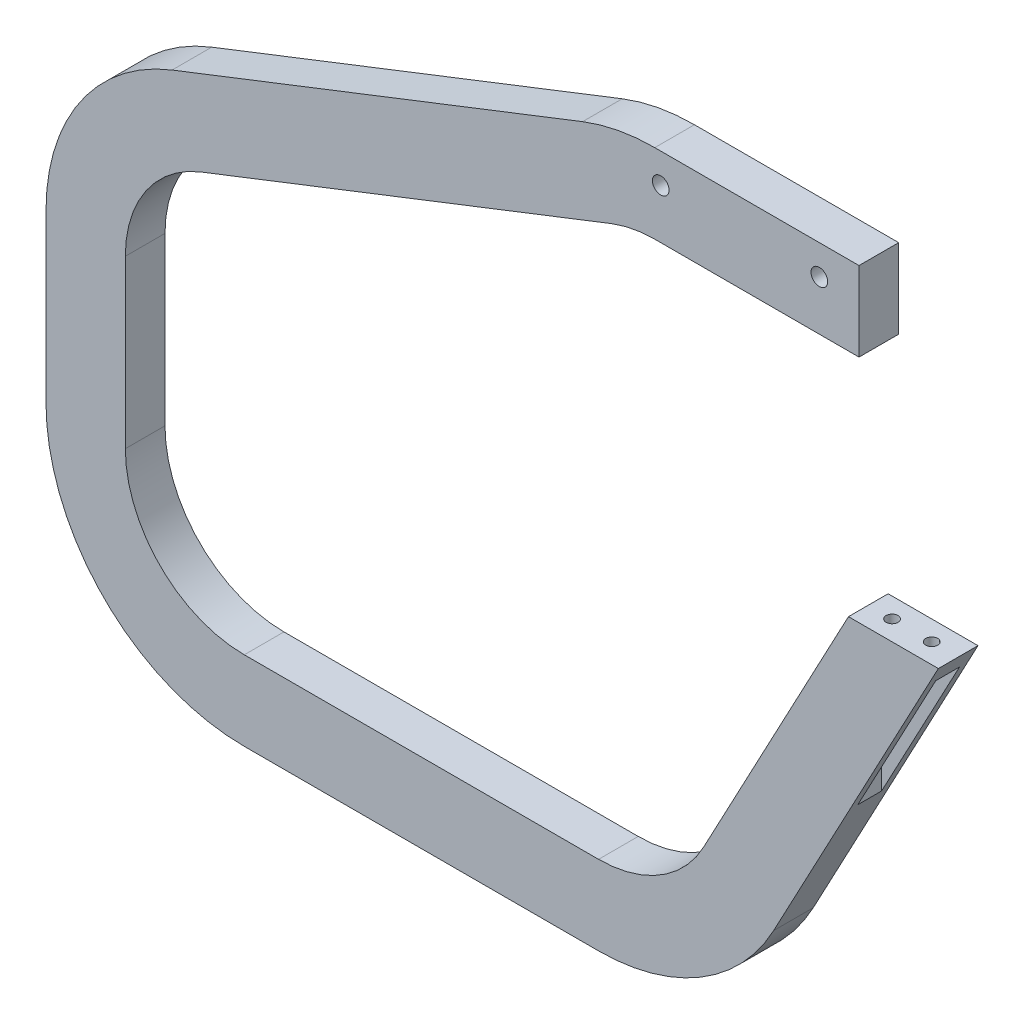
ISO-10303-21;
HEADER;
FILE_DESCRIPTION(('STEP AP214'),'2;1');
FILE_NAME('part.step','',(''),(''),'','','');
FILE_SCHEMA(('AUTOMOTIVE_DESIGN { 1 0 10303 214 1 1 1 1 }'));
ENDSEC;
DATA;
#1=APPLICATION_CONTEXT('core data for automotive mechanical design processes');
#2=APPLICATION_PROTOCOL_DEFINITION('international standard','automotive_design',2000,#1);
#3=PRODUCT_CONTEXT('',#1,'mechanical');
#4=PRODUCT('Part','Part','',(#3));
#5=PRODUCT_RELATED_PRODUCT_CATEGORY('part','',(#4));
#6=PRODUCT_DEFINITION_FORMATION('','',#4);
#7=PRODUCT_DEFINITION_CONTEXT('part definition',#1,'design');
#8=PRODUCT_DEFINITION('design','',#6,#7);
#9=PRODUCT_DEFINITION_SHAPE('','',#8);
#10=(LENGTH_UNIT() NAMED_UNIT(*) SI_UNIT(.MILLI.,.METRE.));
#11=(NAMED_UNIT(*) PLANE_ANGLE_UNIT() SI_UNIT($,.RADIAN.));
#12=(NAMED_UNIT(*) SI_UNIT($,.STERADIAN.) SOLID_ANGLE_UNIT());
#13=UNCERTAINTY_MEASURE_WITH_UNIT(LENGTH_MEASURE(1.E-05),#10,'distance_accuracy_value','');
#14=(GEOMETRIC_REPRESENTATION_CONTEXT(3) GLOBAL_UNCERTAINTY_ASSIGNED_CONTEXT((#13)) GLOBAL_UNIT_ASSIGNED_CONTEXT((#10,
#11,#12)) REPRESENTATION_CONTEXT('',''));
#15=CARTESIAN_POINT('',(0.,0.,0.));
#16=DIRECTION('',(0.,0.,1.));
#17=DIRECTION('',(1.,0.,0.));
#18=AXIS2_PLACEMENT_3D('',#15,#16,#17);
#19=CARTESIAN_POINT('',(0.,-240.,10.));
#20=DIRECTION('',(0.,1.,0.));
#21=DIRECTION('',(-1.,0.,0.));
#22=AXIS2_PLACEMENT_3D('',#19,#20,#21);
#23=PLANE('',#22);
#24=DIRECTION('',(1.,0.,0.));
#25=VECTOR('',#24,1.);
#26=CARTESIAN_POINT('',(0.,-240.,0.));
#27=LINE('',#26,#25);
#28=CARTESIAN_POINT('',(-387.930073268224,-240.,0.));
#29=VERTEX_POINT('',#28);
#30=CARTESIAN_POINT('',(-298.601858771946,-240.,0.));
#31=VERTEX_POINT('',#30);
#32=EDGE_CURVE('E227',#29,#31,#27,.T.);
#33=ORIENTED_EDGE('',*,*,#32,.T.);
#34=DIRECTION('',(0.,0.,-1.));
#35=VECTOR('',#34,1.);
#36=CARTESIAN_POINT('',(-298.601858771946,-240.,10.));
#37=LINE('',#36,#35);
#38=CARTESIAN_POINT('',(-298.601858771946,-240.,10.));
#39=VERTEX_POINT('',#38);
#40=EDGE_CURVE('E11',#39,#31,#37,.T.);
#41=ORIENTED_EDGE('',*,*,#40,.F.);
#42=DIRECTION('',(1.,0.,0.));
#43=VECTOR('',#42,1.);
#44=CARTESIAN_POINT('',(0.,-240.,10.));
#45=LINE('',#44,#43);
#46=CARTESIAN_POINT('',(-387.930073268224,-240.,10.));
#47=VERTEX_POINT('',#46);
#48=EDGE_CURVE('E562',#47,#39,#45,.T.);
#49=ORIENTED_EDGE('',*,*,#48,.F.);
#50=DIRECTION('',(0.,0.,-1.));
#51=VECTOR('',#50,1.);
#52=CARTESIAN_POINT('',(-387.930073268224,-240.,10.));
#53=LINE('',#52,#51);
#54=EDGE_CURVE('E216',#47,#29,#53,.T.);
#55=ORIENTED_EDGE('',*,*,#54,.T.);
#56=EDGE_LOOP('',(#33,#41,#49,#55));
#57=FACE_BOUND('',#56,.T.);
#58=ADVANCED_FACE('F39',(#57),#23,.F.);
#59=CARTESIAN_POINT('',(-298.601858771946,-190.,10.));
#60=DIRECTION('',(0.,0.,-1.));
#61=DIRECTION('',(-1.,0.,0.));
#62=AXIS2_PLACEMENT_3D('',#59,#60,#61);
#63=CYLINDRICAL_SURFACE('',#62,50.);
#64=CARTESIAN_POINT('',(-298.601858771946,-190.,0.));
#65=DIRECTION('',(0.,0.,1.));
#66=DIRECTION('',(1.,0.,0.));
#67=AXIS2_PLACEMENT_3D('',#64,#65,#66);
#68=CIRCLE('',#67,50.);
#69=CARTESIAN_POINT('',(-254.469753791034,-213.502283079603,0.));
#70=VERTEX_POINT('',#69);
#71=EDGE_CURVE('E230',#31,#70,#68,.T.);
#72=ORIENTED_EDGE('',*,*,#71,.T.);
#73=DIRECTION('',(0.,0.,-1.));
#74=VECTOR('',#73,1.);
#75=CARTESIAN_POINT('',(-254.469753791034,-213.502283079603,10.));
#76=LINE('',#75,#74);
#77=CARTESIAN_POINT('',(-254.469753791034,-213.502283079603,10.));
#78=VERTEX_POINT('',#77);
#79=EDGE_CURVE('E47',#78,#70,#76,.T.);
#80=ORIENTED_EDGE('',*,*,#79,.F.);
#81=CARTESIAN_POINT('',(-298.601858771946,-190.,10.));
#82=DIRECTION('',(0.,0.,1.));
#83=DIRECTION('',(1.,0.,0.));
#84=AXIS2_PLACEMENT_3D('',#81,#82,#83);
#85=CIRCLE('',#84,50.);
#86=EDGE_CURVE('E140',#39,#78,#85,.T.);
#87=ORIENTED_EDGE('',*,*,#86,.F.);
#88=ORIENTED_EDGE('',*,*,#40,.T.);
#89=EDGE_LOOP('',(#72,#80,#87,#88));
#90=FACE_BOUND('',#89,.T.);
#91=ADVANCED_FACE('F390',(#90),#63,.T.);
#92=CARTESIAN_POINT('',(-109.668188971471,58.403124508785,10.));
#93=DIRECTION('',(-0.882642099618229,0.470045661592068,0.));
#94=DIRECTION('',(-0.470045661592067,-0.882642099618229,0.));
#95=AXIS2_PLACEMENT_3D('',#92,#93,#94);
#96=PLANE('',#95);
#97=DIRECTION('',(0.,0.,-1.));
#98=VECTOR('',#97,1.);
#99=CARTESIAN_POINT('',(-235.239731932691,-177.392542567877,8.));
#100=LINE('',#99,#98);
#101=CARTESIAN_POINT('',(-235.239731932691,-177.392542567877,8.));
#102=VERTEX_POINT('',#101);
#103=CARTESIAN_POINT('',(-235.239731932691,-177.392542567876,2.));
#104=VERTEX_POINT('',#103);
#105=EDGE_CURVE('E555',#102,#104,#100,.T.);
#106=ORIENTED_EDGE('',*,*,#105,.F.);
#107=DIRECTION('',(-0.470045661592067,-0.882642099618229,0.));
#108=VECTOR('',#107,1.);
#109=CARTESIAN_POINT('',(-215.592792743044,-140.499923245137,8.));
#110=LINE('',#109,#108);
#111=CARTESIAN_POINT('',(-215.592792743044,-140.499923245137,8.));
#112=VERTEX_POINT('',#111);
#113=EDGE_CURVE('E549',#112,#102,#110,.T.);
#114=ORIENTED_EDGE('',*,*,#113,.F.);
#115=DIRECTION('',(0.,0.,-1.));
#116=VECTOR('',#115,1.);
#117=CARTESIAN_POINT('',(-215.592792743044,-140.499923245137,8.));
#118=LINE('',#117,#116);
#119=CARTESIAN_POINT('',(-215.592792743044,-140.499923245137,2.));
#120=VERTEX_POINT('',#119);
#121=EDGE_CURVE('E552',#112,#120,#118,.T.);
#122=ORIENTED_EDGE('',*,*,#121,.T.);
#123=DIRECTION('',(-0.470045661592067,-0.882642099618229,0.));
#124=VECTOR('',#123,1.);
#125=CARTESIAN_POINT('',(-215.592792743044,-140.499923245137,2.));
#126=LINE('',#125,#124);
#127=EDGE_CURVE('E540',#120,#104,#126,.T.);
#128=ORIENTED_EDGE('',*,*,#127,.T.);
#129=EDGE_LOOP('',(#106,#114,#122,#128));
#130=FACE_BOUND('',#129,.T.);
#131=DIRECTION('',(0.470045661592068,0.882642099618229,0.));
#132=VECTOR('',#131,1.);
#133=CARTESIAN_POINT('',(-109.668188971471,58.403124508785,0.));
#134=LINE('',#133,#132);
#135=CARTESIAN_POINT('',(-212.930073268212,-135.499923245137,0.));
#136=VERTEX_POINT('',#135);
#137=EDGE_CURVE('E232',#70,#136,#134,.T.);
#138=ORIENTED_EDGE('',*,*,#137,.T.);
#139=DIRECTION('',(0.,0.,-1.));
#140=VECTOR('',#139,1.);
#141=CARTESIAN_POINT('',(-212.930073268212,-135.499923245137,10.));
#142=LINE('',#141,#140);
#143=CARTESIAN_POINT('',(-212.930073268212,-135.499923245137,10.));
#144=VERTEX_POINT('',#143);
#145=EDGE_CURVE('E309',#144,#136,#142,.T.);
#146=ORIENTED_EDGE('',*,*,#145,.F.);
#147=DIRECTION('',(0.470045661592068,0.882642099618229,0.));
#148=VECTOR('',#147,1.);
#149=CARTESIAN_POINT('',(-109.668188971471,58.403124508785,10.));
#150=LINE('',#149,#148);
#151=EDGE_CURVE('E317',#78,#144,#150,.T.);
#152=ORIENTED_EDGE('',*,*,#151,.F.);
#153=ORIENTED_EDGE('',*,*,#79,.T.);
#154=EDGE_LOOP('',(#138,#146,#152,#153));
#155=FACE_BOUND('',#154,.T.);
#156=ADVANCED_FACE('F315',(#130,#155),#96,.F.);
#157=CARTESIAN_POINT('',(0.,-135.499923245137,10.));
#158=DIRECTION('',(0.,-1.,0.));
#159=DIRECTION('',(0.,0.,-1.));
#160=AXIS2_PLACEMENT_3D('',#157,#158,#159);
#161=PLANE('',#160);
#162=CARTESIAN_POINT('',(-229.592792743044,-135.499923245137,5.));
#163=DIRECTION('',(0.,-1.,0.));
#164=DIRECTION('',(1.,0.,0.));
#165=AXIS2_PLACEMENT_3D('',#162,#163,#164);
#166=CIRCLE('',#165,1.5);
#167=CARTESIAN_POINT('',(-228.092792743044,-135.499923245137,5.));
#168=VERTEX_POINT('',#167);
#169=EDGE_CURVE('E524',#168,#168,#166,.T.);
#170=ORIENTED_EDGE('',*,*,#169,.T.);
#171=EDGE_LOOP('',(#170));
#172=FACE_BOUND('',#171,.T.);
#173=CARTESIAN_POINT('',(-219.592792743044,-135.499923245137,5.));
#174=DIRECTION('',(0.,-1.,0.));
#175=DIRECTION('',(1.,0.,0.));
#176=AXIS2_PLACEMENT_3D('',#173,#174,#175);
#177=CIRCLE('',#176,1.5);
#178=CARTESIAN_POINT('',(-218.092792743044,-135.499923245137,5.));
#179=VERTEX_POINT('',#178);
#180=EDGE_CURVE('E528',#179,#179,#177,.T.);
#181=ORIENTED_EDGE('',*,*,#180,.T.);
#182=EDGE_LOOP('',(#181));
#183=FACE_BOUND('',#182,.T.);
#184=DIRECTION('',(-1.,0.,0.));
#185=VECTOR('',#184,1.);
#186=CARTESIAN_POINT('',(0.,-135.499923245137,0.));
#187=LINE('',#186,#185);
#188=CARTESIAN_POINT('',(-235.589314209303,-135.499923245137,0.));
#189=VERTEX_POINT('',#188);
#190=EDGE_CURVE('E234',#136,#189,#187,.T.);
#191=ORIENTED_EDGE('',*,*,#190,.T.);
#192=DIRECTION('',(0.,0.,-1.));
#193=VECTOR('',#192,1.);
#194=CARTESIAN_POINT('',(-235.589314209303,-135.499923245137,10.));
#195=LINE('',#194,#193);
#196=CARTESIAN_POINT('',(-235.589314209303,-135.499923245137,10.));
#197=VERTEX_POINT('',#196);
#198=EDGE_CURVE('E306',#197,#189,#195,.T.);
#199=ORIENTED_EDGE('',*,*,#198,.F.);
#200=DIRECTION('',(-1.,0.,0.));
#201=VECTOR('',#200,1.);
#202=CARTESIAN_POINT('',(0.,-135.499923245137,10.));
#203=LINE('',#202,#201);
#204=EDGE_CURVE('E335',#144,#197,#203,.T.);
#205=ORIENTED_EDGE('',*,*,#204,.F.);
#206=ORIENTED_EDGE('',*,*,#145,.T.);
#207=EDGE_LOOP('',(#191,#199,#205,#206));
#208=FACE_BOUND('',#207,.T.);
#209=ADVANCED_FACE('F325',(#172,#183,#208),#161,.F.);
#210=CARTESIAN_POINT('',(-127.321030963835,67.8040377406263,10.));
#211=DIRECTION('',(0.882642099618229,-0.470045661592068,0.));
#212=DIRECTION('',(0.470045661592068,0.882642099618229,0.));
#213=AXIS2_PLACEMENT_3D('',#210,#211,#212);
#214=PLANE('',#213);
#215=DIRECTION('',(-0.470045661592068,-0.882642099618229,0.));
#216=VECTOR('',#215,1.);
#217=CARTESIAN_POINT('',(-127.321030963835,67.8040377406263,0.));
#218=LINE('',#217,#216);
#219=CARTESIAN_POINT('',(-272.122595783399,-204.101369847762,0.));
#220=VERTEX_POINT('',#219);
#221=EDGE_CURVE('E236',#189,#220,#218,.T.);
#222=ORIENTED_EDGE('',*,*,#221,.T.);
#223=DIRECTION('',(0.,0.,-1.));
#224=VECTOR('',#223,1.);
#225=CARTESIAN_POINT('',(-272.122595783399,-204.101369847762,10.));
#226=LINE('',#225,#224);
#227=CARTESIAN_POINT('',(-272.122595783399,-204.101369847762,10.));
#228=VERTEX_POINT('',#227);
#229=EDGE_CURVE('E304',#228,#220,#226,.T.);
#230=ORIENTED_EDGE('',*,*,#229,.F.);
#231=DIRECTION('',(-0.470045661592068,-0.882642099618229,0.));
#232=VECTOR('',#231,1.);
#233=CARTESIAN_POINT('',(-127.321030963835,67.8040377406263,10.));
#234=LINE('',#233,#232);
#235=EDGE_CURVE('E331',#197,#228,#234,.T.);
#236=ORIENTED_EDGE('',*,*,#235,.F.);
#237=ORIENTED_EDGE('',*,*,#198,.T.);
#238=EDGE_LOOP('',(#222,#230,#236,#237));
#239=FACE_BOUND('',#238,.T.);
#240=ADVANCED_FACE('F329',(#239),#214,.F.);
#241=CARTESIAN_POINT('',(-298.601858771946,-190.,10.));
#242=DIRECTION('',(0.,0.,-1.));
#243=DIRECTION('',(-1.,0.,0.));
#244=AXIS2_PLACEMENT_3D('',#241,#242,#243);
#245=CYLINDRICAL_SURFACE('',#244,30.);
#246=CARTESIAN_POINT('',(-298.601858771946,-190.,0.));
#247=DIRECTION('',(0.,0.,1.));
#248=DIRECTION('',(1.,0.,0.));
#249=AXIS2_PLACEMENT_3D('',#246,#247,#248);
#250=CIRCLE('',#249,30.);
#251=CARTESIAN_POINT('',(-298.601858771946,-220.,0.));
#252=VERTEX_POINT('',#251);
#253=EDGE_CURVE('E239',#252,#220,#250,.T.);
#254=ORIENTED_EDGE('',*,*,#253,.F.);
#255=DIRECTION('',(0.,0.,-1.));
#256=VECTOR('',#255,1.);
#257=CARTESIAN_POINT('',(-298.601858771946,-220.,10.));
#258=LINE('',#257,#256);
#259=CARTESIAN_POINT('',(-298.601858771946,-220.,10.));
#260=VERTEX_POINT('',#259);
#261=EDGE_CURVE('E302',#260,#252,#258,.T.);
#262=ORIENTED_EDGE('',*,*,#261,.F.);
#263=CARTESIAN_POINT('',(-298.601858771946,-190.,10.));
#264=DIRECTION('',(0.,0.,1.));
#265=DIRECTION('',(1.,0.,0.));
#266=AXIS2_PLACEMENT_3D('',#263,#264,#265);
#267=CIRCLE('',#266,30.);
#268=EDGE_CURVE('E334',#260,#228,#267,.T.);
#269=ORIENTED_EDGE('',*,*,#268,.T.);
#270=ORIENTED_EDGE('',*,*,#229,.T.);
#271=EDGE_LOOP('',(#254,#262,#269,#270));
#272=FACE_BOUND('',#271,.T.);
#273=ADVANCED_FACE('F595',(#272),#245,.F.);
#274=CARTESIAN_POINT('',(0.,-220.,10.));
#275=DIRECTION('',(0.,1.,0.));
#276=DIRECTION('',(-1.,0.,0.));
#277=AXIS2_PLACEMENT_3D('',#274,#275,#276);
#278=PLANE('',#277);
#279=DIRECTION('',(1.,0.,0.));
#280=VECTOR('',#279,1.);
#281=CARTESIAN_POINT('',(0.,-220.,0.));
#282=LINE('',#281,#280);
#283=CARTESIAN_POINT('',(-387.930073268224,-220.,0.));
#284=VERTEX_POINT('',#283);
#285=EDGE_CURVE('E242',#284,#252,#282,.T.);
#286=ORIENTED_EDGE('',*,*,#285,.F.);
#287=DIRECTION('',(0.,0.,-1.));
#288=VECTOR('',#287,1.);
#289=CARTESIAN_POINT('',(-387.930073268224,-220.,10.));
#290=LINE('',#289,#288);
#291=CARTESIAN_POINT('',(-387.930073268224,-220.,10.));
#292=VERTEX_POINT('',#291);
#293=EDGE_CURVE('E300',#292,#284,#290,.T.);
#294=ORIENTED_EDGE('',*,*,#293,.F.);
#295=DIRECTION('',(1.,0.,0.));
#296=VECTOR('',#295,1.);
#297=CARTESIAN_POINT('',(0.,-220.,10.));
#298=LINE('',#297,#296);
#299=EDGE_CURVE('E337',#292,#260,#298,.T.);
#300=ORIENTED_EDGE('',*,*,#299,.T.);
#301=ORIENTED_EDGE('',*,*,#261,.T.);
#302=EDGE_LOOP('',(#286,#294,#300,#301));
#303=FACE_BOUND('',#302,.T.);
#304=ADVANCED_FACE('F602',(#303),#278,.T.);
#305=CARTESIAN_POINT('',(-387.930073268224,-190.,10.));
#306=DIRECTION('',(0.,0.,-1.));
#307=DIRECTION('',(-1.,0.,0.));
#308=AXIS2_PLACEMENT_3D('',#305,#306,#307);
#309=CYLINDRICAL_SURFACE('',#308,30.);
#310=CARTESIAN_POINT('',(-387.930073268224,-190.,0.));
#311=DIRECTION('',(0.,0.,1.));
#312=DIRECTION('',(1.,0.,0.));
#313=AXIS2_PLACEMENT_3D('',#310,#311,#312);
#314=CIRCLE('',#313,30.);
#315=CARTESIAN_POINT('',(-417.930073268224,-190.,0.));
#316=VERTEX_POINT('',#315);
#317=EDGE_CURVE('E245',#284,#316,#314,.F.);
#318=ORIENTED_EDGE('',*,*,#317,.T.);
#319=DIRECTION('',(0.,0.,-1.));
#320=VECTOR('',#319,1.);
#321=CARTESIAN_POINT('',(-417.930073268224,-190.,10.));
#322=LINE('',#321,#320);
#323=CARTESIAN_POINT('',(-417.930073268224,-190.,10.));
#324=VERTEX_POINT('',#323);
#325=EDGE_CURVE('E298',#324,#316,#322,.T.);
#326=ORIENTED_EDGE('',*,*,#325,.F.);
#327=CARTESIAN_POINT('',(-387.930073268224,-190.,10.));
#328=DIRECTION('',(0.,0.,1.));
#329=DIRECTION('',(1.,0.,0.));
#330=AXIS2_PLACEMENT_3D('',#327,#328,#329);
#331=CIRCLE('',#330,30.);
#332=EDGE_CURVE('E344',#292,#324,#331,.F.);
#333=ORIENTED_EDGE('',*,*,#332,.F.);
#334=ORIENTED_EDGE('',*,*,#293,.T.);
#335=EDGE_LOOP('',(#318,#326,#333,#334));
#336=FACE_BOUND('',#335,.T.);
#337=ADVANCED_FACE('F610',(#336),#309,.F.);
#338=CARTESIAN_POINT('',(-417.930073268224,0.,10.));
#339=DIRECTION('',(1.,0.,0.));
#340=DIRECTION('',(0.,0.,-1.));
#341=AXIS2_PLACEMENT_3D('',#338,#339,#340);
#342=PLANE('',#341);
#343=DIRECTION('',(0.,-1.,0.));
#344=VECTOR('',#343,1.);
#345=CARTESIAN_POINT('',(-417.930073268224,0.,0.));
#346=LINE('',#345,#344);
#347=CARTESIAN_POINT('',(-417.930073268224,-147.979949055056,0.));
#348=VERTEX_POINT('',#347);
#349=EDGE_CURVE('E248',#348,#316,#346,.T.);
#350=ORIENTED_EDGE('',*,*,#349,.F.);
#351=DIRECTION('',(0.,0.,-1.));
#352=VECTOR('',#351,1.);
#353=CARTESIAN_POINT('',(-417.930073268224,-147.979949055056,10.));
#354=LINE('',#353,#352);
#355=CARTESIAN_POINT('',(-417.930073268224,-147.979949055056,10.));
#356=VERTEX_POINT('',#355);
#357=EDGE_CURVE('E296',#356,#348,#354,.T.);
#358=ORIENTED_EDGE('',*,*,#357,.F.);
#359=DIRECTION('',(0.,-1.,0.));
#360=VECTOR('',#359,1.);
#361=CARTESIAN_POINT('',(-417.930073268224,0.,10.));
#362=LINE('',#361,#360);
#363=EDGE_CURVE('E346',#356,#324,#362,.T.);
#364=ORIENTED_EDGE('',*,*,#363,.T.);
#365=ORIENTED_EDGE('',*,*,#325,.T.);
#366=EDGE_LOOP('',(#350,#358,#364,#365));
#367=FACE_BOUND('',#366,.T.);
#368=ADVANCED_FACE('F618',(#367),#342,.T.);
#369=CARTESIAN_POINT('',(-387.930073268224,-147.979949055056,10.));
#370=DIRECTION('',(0.,0.,-1.));
#371=DIRECTION('',(-1.,0.,0.));
#372=AXIS2_PLACEMENT_3D('',#369,#370,#371);
#373=CYLINDRICAL_SURFACE('',#372,30.);
#374=CARTESIAN_POINT('',(-387.930073268224,-147.979949055056,0.));
#375=DIRECTION('',(0.,0.,1.));
#376=DIRECTION('',(1.,0.,0.));
#377=AXIS2_PLACEMENT_3D('',#374,#375,#376);
#378=CIRCLE('',#377,30.);
#379=CARTESIAN_POINT('',(-398.856791898701,-120.040607259473,0.));
#380=VERTEX_POINT('',#379);
#381=EDGE_CURVE('E251',#348,#380,#378,.F.);
#382=ORIENTED_EDGE('',*,*,#381,.T.);
#383=DIRECTION('',(0.,0.,-1.));
#384=VECTOR('',#383,1.);
#385=CARTESIAN_POINT('',(-398.856791898701,-120.040607259473,10.));
#386=LINE('',#385,#384);
#387=CARTESIAN_POINT('',(-398.856791898701,-120.040607259473,10.));
#388=VERTEX_POINT('',#387);
#389=EDGE_CURVE('E294',#388,#380,#386,.T.);
#390=ORIENTED_EDGE('',*,*,#389,.F.);
#391=CARTESIAN_POINT('',(-387.930073268224,-147.979949055056,10.));
#392=DIRECTION('',(0.,0.,1.));
#393=DIRECTION('',(1.,0.,0.));
#394=AXIS2_PLACEMENT_3D('',#391,#392,#393);
#395=CIRCLE('',#394,30.);
#396=EDGE_CURVE('E349',#356,#388,#395,.F.);
#397=ORIENTED_EDGE('',*,*,#396,.F.);
#398=ORIENTED_EDGE('',*,*,#357,.T.);
#399=EDGE_LOOP('',(#382,#390,#397,#398));
#400=FACE_BOUND('',#399,.T.);
#401=ADVANCED_FACE('F626',(#400),#373,.F.);
#402=CARTESIAN_POINT('',(-12.1934941980004,31.1784547220029,10.));
#403=DIRECTION('',(0.364223954349227,-0.931311393186088,0.));
#404=DIRECTION('',(0.931311393186088,0.364223954349227,0.));
#405=AXIS2_PLACEMENT_3D('',#402,#403,#404);
#406=PLANE('',#405);
#407=DIRECTION('',(-0.931311393186088,-0.364223954349227,0.));
#408=VECTOR('',#407,1.);
#409=CARTESIAN_POINT('',(-12.1934941980004,31.1784547220029,0.));
#410=LINE('',#409,#408);
#411=CARTESIAN_POINT('',(-295.350394850752,-79.5605814495533,0.));
#412=VERTEX_POINT('',#411);
#413=EDGE_CURVE('E254',#412,#380,#410,.T.);
#414=ORIENTED_EDGE('',*,*,#413,.F.);
#415=DIRECTION('',(0.,0.,-1.));
#416=VECTOR('',#415,1.);
#417=CARTESIAN_POINT('',(-295.350394850752,-79.5605814495533,10.));
#418=LINE('',#417,#416);
#419=CARTESIAN_POINT('',(-295.350394850752,-79.5605814495533,10.));
#420=VERTEX_POINT('',#419);
#421=EDGE_CURVE('E292',#420,#412,#418,.T.);
#422=ORIENTED_EDGE('',*,*,#421,.F.);
#423=DIRECTION('',(-0.931311393186088,-0.364223954349227,0.));
#424=VECTOR('',#423,1.);
#425=CARTESIAN_POINT('',(-12.1934941980004,31.1784547220029,10.));
#426=LINE('',#425,#424);
#427=EDGE_CURVE('E351',#420,#388,#426,.T.);
#428=ORIENTED_EDGE('',*,*,#427,.T.);
#429=ORIENTED_EDGE('',*,*,#389,.T.);
#430=EDGE_LOOP('',(#414,#422,#428,#429));
#431=FACE_BOUND('',#430,.T.);
#432=ADVANCED_FACE('F634',(#431),#406,.T.);
#433=CARTESIAN_POINT('',(-284.423676220276,-107.499923245136,10.));
#434=DIRECTION('',(0.,0.,-1.));
#435=DIRECTION('',(-1.,0.,0.));
#436=AXIS2_PLACEMENT_3D('',#433,#434,#435);
#437=CYLINDRICAL_SURFACE('',#436,30.);
#438=CARTESIAN_POINT('',(-284.423676220276,-107.499923245136,0.));
#439=DIRECTION('',(0.,0.,1.));
#440=DIRECTION('',(1.,0.,0.));
#441=AXIS2_PLACEMENT_3D('',#438,#439,#440);
#442=CIRCLE('',#441,30.);
#443=CARTESIAN_POINT('',(-284.423676220276,-77.4999232451359,0.));
#444=VERTEX_POINT('',#443);
#445=EDGE_CURVE('E257',#444,#412,#442,.T.);
#446=ORIENTED_EDGE('',*,*,#445,.F.);
#447=DIRECTION('',(0.,0.,-1.));
#448=VECTOR('',#447,1.);
#449=CARTESIAN_POINT('',(-284.423676220276,-77.4999232451359,10.));
#450=LINE('',#449,#448);
#451=CARTESIAN_POINT('',(-284.423676220276,-77.4999232451359,10.));
#452=VERTEX_POINT('',#451);
#453=EDGE_CURVE('E290',#452,#444,#450,.T.);
#454=ORIENTED_EDGE('',*,*,#453,.F.);
#455=CARTESIAN_POINT('',(-284.423676220276,-107.499923245136,10.));
#456=DIRECTION('',(0.,0.,1.));
#457=DIRECTION('',(1.,0.,0.));
#458=AXIS2_PLACEMENT_3D('',#455,#456,#457);
#459=CIRCLE('',#458,30.);
#460=EDGE_CURVE('E354',#452,#420,#459,.T.);
#461=ORIENTED_EDGE('',*,*,#460,.T.);
#462=ORIENTED_EDGE('',*,*,#421,.T.);
#463=EDGE_LOOP('',(#446,#454,#461,#462));
#464=FACE_BOUND('',#463,.T.);
#465=ADVANCED_FACE('F642',(#464),#437,.F.);
#466=CARTESIAN_POINT('',(0.,-77.4999232451359,10.));
#467=DIRECTION('',(0.,-1.,0.));
#468=DIRECTION('',(1.,0.,0.));
#469=AXIS2_PLACEMENT_3D('',#466,#467,#468);
#470=PLANE('',#469);
#471=DIRECTION('',(-1.,0.,0.));
#472=VECTOR('',#471,1.);
#473=CARTESIAN_POINT('',(0.,-77.4999232451359,0.));
#474=LINE('',#473,#472);
#475=CARTESIAN_POINT('',(-232.930073268212,-77.4999232451359,0.));
#476=VERTEX_POINT('',#475);
#477=EDGE_CURVE('E260',#476,#444,#474,.T.);
#478=ORIENTED_EDGE('',*,*,#477,.F.);
#479=DIRECTION('',(0.,0.,-1.));
#480=VECTOR('',#479,1.);
#481=CARTESIAN_POINT('',(-232.930073268212,-77.4999232451359,10.));
#482=LINE('',#481,#480);
#483=CARTESIAN_POINT('',(-232.930073268212,-77.4999232451359,10.));
#484=VERTEX_POINT('',#483);
#485=EDGE_CURVE('E288',#484,#476,#482,.T.);
#486=ORIENTED_EDGE('',*,*,#485,.F.);
#487=DIRECTION('',(-1.,0.,0.));
#488=VECTOR('',#487,1.);
#489=CARTESIAN_POINT('',(0.,-77.4999232451359,10.));
#490=LINE('',#489,#488);
#491=EDGE_CURVE('E357',#484,#452,#490,.T.);
#492=ORIENTED_EDGE('',*,*,#491,.T.);
#493=ORIENTED_EDGE('',*,*,#453,.T.);
#494=EDGE_LOOP('',(#478,#486,#492,#493));
#495=FACE_BOUND('',#494,.T.);
#496=ADVANCED_FACE('F650',(#495),#470,.T.);
#497=CARTESIAN_POINT('',(-232.930073268212,0.,10.));
#498=DIRECTION('',(-1.,0.,0.));
#499=DIRECTION('',(0.,0.,1.));
#500=AXIS2_PLACEMENT_3D('',#497,#498,#499);
#501=PLANE('',#500);
#502=DIRECTION('',(0.,1.,0.));
#503=VECTOR('',#502,1.);
#504=CARTESIAN_POINT('',(-232.930073268212,0.,0.));
#505=LINE('',#504,#503);
#506=CARTESIAN_POINT('',(-232.930073268212,-57.5,0.));
#507=VERTEX_POINT('',#506);
#508=EDGE_CURVE('E263',#476,#507,#505,.T.);
#509=ORIENTED_EDGE('',*,*,#508,.T.);
#510=DIRECTION('',(0.,0.,-1.));
#511=VECTOR('',#510,1.);
#512=CARTESIAN_POINT('',(-232.930073268212,-57.5,10.));
#513=LINE('',#512,#511);
#514=CARTESIAN_POINT('',(-232.930073268212,-57.5,10.));
#515=VERTEX_POINT('',#514);
#516=EDGE_CURVE('E285',#515,#507,#513,.T.);
#517=ORIENTED_EDGE('',*,*,#516,.F.);
#518=DIRECTION('',(0.,1.,0.));
#519=VECTOR('',#518,1.);
#520=CARTESIAN_POINT('',(-232.930073268212,0.,10.));
#521=LINE('',#520,#519);
#522=EDGE_CURVE('E360',#484,#515,#521,.T.);
#523=ORIENTED_EDGE('',*,*,#522,.F.);
#524=ORIENTED_EDGE('',*,*,#485,.T.);
#525=EDGE_LOOP('',(#509,#517,#523,#524));
#526=FACE_BOUND('',#525,.T.);
#527=ADVANCED_FACE('F658',(#526),#501,.F.);
#528=CARTESIAN_POINT('',(0.,-57.5,10.));
#529=DIRECTION('',(0.,-1.,0.));
#530=DIRECTION('',(1.,0.,0.));
#531=AXIS2_PLACEMENT_3D('',#528,#529,#530);
#532=PLANE('',#531);
#533=DIRECTION('',(-1.,0.,0.));
#534=VECTOR('',#533,1.);
#535=CARTESIAN_POINT('',(0.,-57.5,0.));
#536=LINE('',#535,#534);
#537=CARTESIAN_POINT('',(-284.423872480512,-57.5,0.));
#538=VERTEX_POINT('',#537);
#539=EDGE_CURVE('E265',#507,#538,#536,.T.);
#540=ORIENTED_EDGE('',*,*,#539,.T.);
#541=DIRECTION('',(0.,0.,-1.));
#542=VECTOR('',#541,1.);
#543=CARTESIAN_POINT('',(-284.423872480512,-57.5,10.));
#544=LINE('',#543,#542);
#545=CARTESIAN_POINT('',(-284.423872480512,-57.5,10.));
#546=VERTEX_POINT('',#545);
#547=EDGE_CURVE('E283',#546,#538,#544,.T.);
#548=ORIENTED_EDGE('',*,*,#547,.F.);
#549=DIRECTION('',(-1.,0.,0.));
#550=VECTOR('',#549,1.);
#551=CARTESIAN_POINT('',(0.,-57.5,10.));
#552=LINE('',#551,#550);
#553=EDGE_CURVE('E362',#515,#546,#552,.T.);
#554=ORIENTED_EDGE('',*,*,#553,.F.);
#555=ORIENTED_EDGE('',*,*,#516,.T.);
#556=EDGE_LOOP('',(#540,#548,#554,#555));
#557=FACE_BOUND('',#556,.T.);
#558=ADVANCED_FACE('F375',(#557),#532,.F.);
#559=CARTESIAN_POINT('',(-284.423872480512,-107.5,10.));
#560=DIRECTION('',(0.,0.,-1.));
#561=DIRECTION('',(-1.,0.,0.));
#562=AXIS2_PLACEMENT_3D('',#559,#560,#561);
#563=CYLINDRICAL_SURFACE('',#562,50.);
#564=CARTESIAN_POINT('',(-284.423872480512,-107.5,0.));
#565=DIRECTION('',(0.,0.,1.));
#566=DIRECTION('',(1.,0.,0.));
#567=AXIS2_PLACEMENT_3D('',#564,#565,#566);
#568=CIRCLE('',#567,50.);
#569=CARTESIAN_POINT('',(-302.635070197974,-60.9344303406957,0.));
#570=VERTEX_POINT('',#569);
#571=EDGE_CURVE('E268',#570,#538,#568,.F.);
#572=ORIENTED_EDGE('',*,*,#571,.F.);
#573=DIRECTION('',(0.,0.,-1.));
#574=VECTOR('',#573,1.);
#575=CARTESIAN_POINT('',(-302.635070197974,-60.9344303406957,10.));
#576=LINE('',#575,#574);
#577=CARTESIAN_POINT('',(-302.635070197974,-60.9344303406957,10.));
#578=VERTEX_POINT('',#577);
#579=EDGE_CURVE('E281',#578,#570,#576,.T.);
#580=ORIENTED_EDGE('',*,*,#579,.F.);
#581=CARTESIAN_POINT('',(-284.423872480512,-107.5,10.));
#582=DIRECTION('',(0.,0.,1.));
#583=DIRECTION('',(1.,0.,0.));
#584=AXIS2_PLACEMENT_3D('',#581,#582,#583);
#585=CIRCLE('',#584,50.);
#586=EDGE_CURVE('E364',#578,#546,#585,.F.);
#587=ORIENTED_EDGE('',*,*,#586,.T.);
#588=ORIENTED_EDGE('',*,*,#547,.T.);
#589=EDGE_LOOP('',(#572,#580,#587,#588));
#590=FACE_BOUND('',#589,.T.);
#591=ADVANCED_FACE('F368',(#590),#563,.T.);
#592=CARTESIAN_POINT('',(-19.4779732849848,49.8046825857245,10.));
#593=DIRECTION('',(0.364223954349226,-0.931311393186088,0.));
#594=DIRECTION('',(0.931311393186088,0.364223954349227,0.));
#595=AXIS2_PLACEMENT_3D('',#592,#593,#594);
#596=PLANE('',#595);
#597=DIRECTION('',(-0.931311393186088,-0.364223954349227,0.));
#598=VECTOR('',#597,1.);
#599=CARTESIAN_POINT('',(-19.4779732849848,49.8046825857245,0.));
#600=LINE('',#599,#598);
#601=CARTESIAN_POINT('',(-406.141270985686,-101.414379395751,0.));
#602=VERTEX_POINT('',#601);
#603=EDGE_CURVE('E271',#570,#602,#600,.T.);
#604=ORIENTED_EDGE('',*,*,#603,.T.);
#605=DIRECTION('',(0.,0.,-1.));
#606=VECTOR('',#605,1.);
#607=CARTESIAN_POINT('',(-406.141270985686,-101.414379395751,10.));
#608=LINE('',#607,#606);
#609=CARTESIAN_POINT('',(-406.141270985686,-101.414379395751,10.));
#610=VERTEX_POINT('',#609);
#611=EDGE_CURVE('E211',#610,#602,#608,.T.);
#612=ORIENTED_EDGE('',*,*,#611,.F.);
#613=DIRECTION('',(-0.931311393186088,-0.364223954349227,0.));
#614=VECTOR('',#613,1.);
#615=CARTESIAN_POINT('',(-19.4779732849848,49.8046825857245,10.));
#616=LINE('',#615,#614);
#617=EDGE_CURVE('E199',#578,#610,#616,.T.);
#618=ORIENTED_EDGE('',*,*,#617,.F.);
#619=ORIENTED_EDGE('',*,*,#579,.T.);
#620=EDGE_LOOP('',(#604,#612,#618,#619));
#621=FACE_BOUND('',#620,.T.);
#622=ADVANCED_FACE('F380',(#621),#596,.F.);
#623=CARTESIAN_POINT('',(-387.930073268224,-147.979949055056,10.));
#624=DIRECTION('',(0.,0.,-1.));
#625=DIRECTION('',(-1.,0.,0.));
#626=AXIS2_PLACEMENT_3D('',#623,#624,#625);
#627=CYLINDRICAL_SURFACE('',#626,50.);
#628=CARTESIAN_POINT('',(-387.930073268224,-147.979949055056,0.));
#629=DIRECTION('',(0.,0.,1.));
#630=DIRECTION('',(1.,0.,0.));
#631=AXIS2_PLACEMENT_3D('',#628,#629,#630);
#632=CIRCLE('',#631,50.);
#633=CARTESIAN_POINT('',(-437.930073268224,-147.979949055056,0.));
#634=VERTEX_POINT('',#633);
#635=EDGE_CURVE('E208',#602,#634,#632,.T.);
#636=ORIENTED_EDGE('',*,*,#635,.T.);
#637=DIRECTION('',(0.,0.,-1.));
#638=VECTOR('',#637,1.);
#639=CARTESIAN_POINT('',(-437.930073268224,-147.979949055056,10.));
#640=LINE('',#639,#638);
#641=CARTESIAN_POINT('',(-437.930073268224,-147.979949055056,10.));
#642=VERTEX_POINT('',#641);
#643=EDGE_CURVE('E205',#642,#634,#640,.T.);
#644=ORIENTED_EDGE('',*,*,#643,.F.);
#645=CARTESIAN_POINT('',(-387.930073268224,-147.979949055056,10.));
#646=DIRECTION('',(0.,0.,1.));
#647=DIRECTION('',(1.,0.,0.));
#648=AXIS2_PLACEMENT_3D('',#645,#646,#647);
#649=CIRCLE('',#648,50.);
#650=EDGE_CURVE('E191',#610,#642,#649,.T.);
#651=ORIENTED_EDGE('',*,*,#650,.F.);
#652=ORIENTED_EDGE('',*,*,#611,.T.);
#653=EDGE_LOOP('',(#636,#644,#651,#652));
#654=FACE_BOUND('',#653,.T.);
#655=ADVANCED_FACE('F206',(#654),#627,.T.);
#656=CARTESIAN_POINT('',(-437.930073268224,0.,10.));
#657=DIRECTION('',(1.,0.,0.));
#658=DIRECTION('',(0.,0.,-1.));
#659=AXIS2_PLACEMENT_3D('',#656,#657,#658);
#660=PLANE('',#659);
#661=DIRECTION('',(0.,-1.,0.));
#662=VECTOR('',#661,1.);
#663=CARTESIAN_POINT('',(-437.930073268224,0.,0.));
#664=LINE('',#663,#662);
#665=CARTESIAN_POINT('',(-437.930073268224,-190.,0.));
#666=VERTEX_POINT('',#665);
#667=EDGE_CURVE('E274',#634,#666,#664,.T.);
#668=ORIENTED_EDGE('',*,*,#667,.T.);
#669=DIRECTION('',(0.,0.,-1.));
#670=VECTOR('',#669,1.);
#671=CARTESIAN_POINT('',(-437.930073268224,-190.,10.));
#672=LINE('',#671,#670);
#673=CARTESIAN_POINT('',(-437.930073268224,-190.,10.));
#674=VERTEX_POINT('',#673);
#675=EDGE_CURVE('E212',#674,#666,#672,.T.);
#676=ORIENTED_EDGE('',*,*,#675,.F.);
#677=DIRECTION('',(0.,-1.,0.));
#678=VECTOR('',#677,1.);
#679=CARTESIAN_POINT('',(-437.930073268224,0.,10.));
#680=LINE('',#679,#678);
#681=EDGE_CURVE('E195',#642,#674,#680,.T.);
#682=ORIENTED_EDGE('',*,*,#681,.F.);
#683=ORIENTED_EDGE('',*,*,#643,.T.);
#684=EDGE_LOOP('',(#668,#676,#682,#683));
#685=FACE_BOUND('',#684,.T.);
#686=ADVANCED_FACE('F214',(#685),#660,.F.);
#687=CARTESIAN_POINT('',(-282.930073268212,-65.,10.));
#688=DIRECTION('',(0.,0.,-1.));
#689=DIRECTION('',(-1.,0.,0.));
#690=AXIS2_PLACEMENT_3D('',#687,#688,#689);
#691=CYLINDRICAL_SURFACE('',#690,2.09999999999999);
#692=CARTESIAN_POINT('',(-282.930073268212,-65.,10.));
#693=DIRECTION('',(0.,0.,1.));
#694=DIRECTION('',(1.,0.,0.));
#695=AXIS2_PLACEMENT_3D('',#692,#693,#694);
#696=CIRCLE('',#695,2.09999999999999);
#697=CARTESIAN_POINT('',(-280.830073268212,-65.,10.));
#698=VERTEX_POINT('',#697);
#699=EDGE_CURVE('E411',#698,#698,#696,.T.);
#700=ORIENTED_EDGE('',*,*,#699,.T.);
#701=EDGE_LOOP('',(#700));
#702=FACE_BOUND('',#701,.T.);
#703=CARTESIAN_POINT('',(-282.930073268212,-65.,0.));
#704=DIRECTION('',(0.,0.,1.));
#705=DIRECTION('',(1.,0.,0.));
#706=AXIS2_PLACEMENT_3D('',#703,#704,#705);
#707=CIRCLE('',#706,2.09999999999999);
#708=CARTESIAN_POINT('',(-280.830073268212,-65.,0.));
#709=VERTEX_POINT('',#708);
#710=EDGE_CURVE('E223',#709,#709,#707,.T.);
#711=ORIENTED_EDGE('',*,*,#710,.F.);
#712=EDGE_LOOP('',(#711));
#713=FACE_BOUND('',#712,.T.);
#714=ADVANCED_FACE('F398',(#702,#713),#691,.F.);
#715=CARTESIAN_POINT('',(-242.930073268212,-65.,10.));
#716=DIRECTION('',(0.,0.,-1.));
#717=DIRECTION('',(-1.,0.,0.));
#718=AXIS2_PLACEMENT_3D('',#715,#716,#717);
#719=CYLINDRICAL_SURFACE('',#718,2.09999999999999);
#720=CARTESIAN_POINT('',(-242.930073268212,-65.,10.));
#721=DIRECTION('',(0.,0.,1.));
#722=DIRECTION('',(1.,0.,0.));
#723=AXIS2_PLACEMENT_3D('',#720,#721,#722);
#724=CIRCLE('',#723,2.09999999999999);
#725=CARTESIAN_POINT('',(-240.830073268212,-65.,10.));
#726=VERTEX_POINT('',#725);
#727=EDGE_CURVE('E277',#726,#726,#724,.T.);
#728=ORIENTED_EDGE('',*,*,#727,.T.);
#729=EDGE_LOOP('',(#728));
#730=FACE_BOUND('',#729,.T.);
#731=CARTESIAN_POINT('',(-242.930073268212,-65.,0.));
#732=DIRECTION('',(0.,0.,1.));
#733=DIRECTION('',(1.,0.,0.));
#734=AXIS2_PLACEMENT_3D('',#731,#732,#733);
#735=CIRCLE('',#734,2.09999999999999);
#736=CARTESIAN_POINT('',(-240.830073268212,-65.,0.));
#737=VERTEX_POINT('',#736);
#738=EDGE_CURVE('E220',#737,#737,#735,.T.);
#739=ORIENTED_EDGE('',*,*,#738,.F.);
#740=EDGE_LOOP('',(#739));
#741=FACE_BOUND('',#740,.T.);
#742=ADVANCED_FACE('F41',(#730,#741),#719,.F.);
#743=CARTESIAN_POINT('',(-387.930073268224,-190.,10.));
#744=DIRECTION('',(0.,0.,-1.));
#745=DIRECTION('',(-1.,0.,0.));
#746=AXIS2_PLACEMENT_3D('',#743,#744,#745);
#747=CYLINDRICAL_SURFACE('',#746,50.);
#748=CARTESIAN_POINT('',(-387.930073268224,-190.,0.));
#749=DIRECTION('',(0.,0.,1.));
#750=DIRECTION('',(1.,0.,0.));
#751=AXIS2_PLACEMENT_3D('',#748,#749,#750);
#752=CIRCLE('',#751,50.);
#753=EDGE_CURVE('E132',#666,#29,#752,.T.);
#754=ORIENTED_EDGE('',*,*,#753,.T.);
#755=ORIENTED_EDGE('',*,*,#54,.F.);
#756=CARTESIAN_POINT('',(-387.930073268224,-190.,10.));
#757=DIRECTION('',(0.,0.,1.));
#758=DIRECTION('',(1.,0.,0.));
#759=AXIS2_PLACEMENT_3D('',#756,#757,#758);
#760=CIRCLE('',#759,50.);
#761=EDGE_CURVE('E63',#674,#47,#760,.T.);
#762=ORIENTED_EDGE('',*,*,#761,.F.);
#763=ORIENTED_EDGE('',*,*,#675,.T.);
#764=EDGE_LOOP('',(#754,#755,#762,#763));
#765=FACE_BOUND('',#764,.T.);
#766=ADVANCED_FACE('F405',(#765),#747,.T.);
#767=CARTESIAN_POINT('',(0.,0.,10.));
#768=DIRECTION('',(0.,0.,1.));
#769=DIRECTION('',(1.,0.,0.));
#770=AXIS2_PLACEMENT_3D('',#767,#768,#769);
#771=PLANE('',#770);
#772=ORIENTED_EDGE('',*,*,#727,.F.);
#773=EDGE_LOOP('',(#772));
#774=FACE_BOUND('',#773,.T.);
#775=ORIENTED_EDGE('',*,*,#699,.F.);
#776=EDGE_LOOP('',(#775));
#777=FACE_BOUND('',#776,.T.);
#778=ORIENTED_EDGE('',*,*,#48,.T.);
#779=ORIENTED_EDGE('',*,*,#86,.T.);
#780=ORIENTED_EDGE('',*,*,#151,.T.);
#781=ORIENTED_EDGE('',*,*,#204,.T.);
#782=ORIENTED_EDGE('',*,*,#235,.T.);
#783=ORIENTED_EDGE('',*,*,#268,.F.);
#784=ORIENTED_EDGE('',*,*,#299,.F.);
#785=ORIENTED_EDGE('',*,*,#332,.T.);
#786=ORIENTED_EDGE('',*,*,#363,.F.);
#787=ORIENTED_EDGE('',*,*,#396,.T.);
#788=ORIENTED_EDGE('',*,*,#427,.F.);
#789=ORIENTED_EDGE('',*,*,#460,.F.);
#790=ORIENTED_EDGE('',*,*,#491,.F.);
#791=ORIENTED_EDGE('',*,*,#522,.T.);
#792=ORIENTED_EDGE('',*,*,#553,.T.);
#793=ORIENTED_EDGE('',*,*,#586,.F.);
#794=ORIENTED_EDGE('',*,*,#617,.T.);
#795=ORIENTED_EDGE('',*,*,#650,.T.);
#796=ORIENTED_EDGE('',*,*,#681,.T.);
#797=ORIENTED_EDGE('',*,*,#761,.T.);
#798=EDGE_LOOP('',(#778,#779,#780,#781,#782,#783,#784,#785,#786,#787,#788,#789,#790,#791,#792,
#793,#794,#795,#796,#797));
#799=FACE_BOUND('',#798,.T.);
#800=ADVANCED_FACE('F193',(#774,#777,#799),#771,.T.);
#801=CARTESIAN_POINT('',(0.,0.,0.));
#802=DIRECTION('',(0.,0.,1.));
#803=DIRECTION('',(1.,0.,0.));
#804=AXIS2_PLACEMENT_3D('',#801,#802,#803);
#805=PLANE('',#804);
#806=ORIENTED_EDGE('',*,*,#738,.T.);
#807=EDGE_LOOP('',(#806));
#808=FACE_BOUND('',#807,.T.);
#809=ORIENTED_EDGE('',*,*,#710,.T.);
#810=EDGE_LOOP('',(#809));
#811=FACE_BOUND('',#810,.T.);
#812=ORIENTED_EDGE('',*,*,#32,.F.);
#813=ORIENTED_EDGE('',*,*,#753,.F.);
#814=ORIENTED_EDGE('',*,*,#667,.F.);
#815=ORIENTED_EDGE('',*,*,#635,.F.);
#816=ORIENTED_EDGE('',*,*,#603,.F.);
#817=ORIENTED_EDGE('',*,*,#571,.T.);
#818=ORIENTED_EDGE('',*,*,#539,.F.);
#819=ORIENTED_EDGE('',*,*,#508,.F.);
#820=ORIENTED_EDGE('',*,*,#477,.T.);
#821=ORIENTED_EDGE('',*,*,#445,.T.);
#822=ORIENTED_EDGE('',*,*,#413,.T.);
#823=ORIENTED_EDGE('',*,*,#381,.F.);
#824=ORIENTED_EDGE('',*,*,#349,.T.);
#825=ORIENTED_EDGE('',*,*,#317,.F.);
#826=ORIENTED_EDGE('',*,*,#285,.T.);
#827=ORIENTED_EDGE('',*,*,#253,.T.);
#828=ORIENTED_EDGE('',*,*,#221,.F.);
#829=ORIENTED_EDGE('',*,*,#190,.F.);
#830=ORIENTED_EDGE('',*,*,#137,.F.);
#831=ORIENTED_EDGE('',*,*,#71,.F.);
#832=EDGE_LOOP('',(#812,#813,#814,#815,#816,#817,#818,#819,#820,#821,#822,#823,#824,#825,#826,
#827,#828,#829,#830,#831));
#833=FACE_BOUND('',#832,.T.);
#834=ADVANCED_FACE('F321',(#808,#811,#833),#805,.F.);
#835=CARTESIAN_POINT('',(-235.239731932691,-140.499923245137,8.));
#836=DIRECTION('',(1.,0.,0.));
#837=DIRECTION('',(0.,0.,-1.));
#838=AXIS2_PLACEMENT_3D('',#835,#836,#837);
#839=PLANE('',#838);
#840=DIRECTION('',(0.,0.,-1.));
#841=VECTOR('',#840,1.);
#842=CARTESIAN_POINT('',(-235.239731932691,-140.499923245137,8.));
#843=LINE('',#842,#841);
#844=CARTESIAN_POINT('',(-235.239731932691,-140.499923245137,8.));
#845=VERTEX_POINT('',#844);
#846=CARTESIAN_POINT('',(-235.239731932691,-140.499923245137,2.));
#847=VERTEX_POINT('',#846);
#848=EDGE_CURVE('E224',#845,#847,#843,.T.);
#849=ORIENTED_EDGE('',*,*,#848,.F.);
#850=DIRECTION('',(0.,-1.,0.));
#851=VECTOR('',#850,1.);
#852=CARTESIAN_POINT('',(-235.239731932691,-140.499923245137,8.));
#853=LINE('',#852,#851);
#854=EDGE_CURVE('E546',#845,#102,#853,.T.);
#855=ORIENTED_EDGE('',*,*,#854,.T.);
#856=ORIENTED_EDGE('',*,*,#105,.T.);
#857=DIRECTION('',(0.,-1.,0.));
#858=VECTOR('',#857,1.);
#859=CARTESIAN_POINT('',(-235.239731932691,-140.499923245137,2.));
#860=LINE('',#859,#858);
#861=EDGE_CURVE('E54',#847,#104,#860,.T.);
#862=ORIENTED_EDGE('',*,*,#861,.F.);
#863=EDGE_LOOP('',(#849,#855,#856,#862));
#864=FACE_BOUND('',#863,.T.);
#865=ADVANCED_FACE('F415',(#864),#839,.T.);
#866=CARTESIAN_POINT('',(-230.589314209303,-140.499923245137,8.));
#867=DIRECTION('',(0.,1.,0.));
#868=DIRECTION('',(-1.,0.,0.));
#869=AXIS2_PLACEMENT_3D('',#866,#867,#868);
#870=PLANE('',#869);
#871=CARTESIAN_POINT('',(-229.592792743044,-140.499923245137,5.));
#872=DIRECTION('',(0.,-1.,0.));
#873=DIRECTION('',(1.,0.,0.));
#874=AXIS2_PLACEMENT_3D('',#871,#872,#873);
#875=CIRCLE('',#874,1.5);
#876=CARTESIAN_POINT('',(-228.092792743044,-140.499923245137,5.));
#877=VERTEX_POINT('',#876);
#878=EDGE_CURVE('E527',#877,#877,#875,.T.);
#879=ORIENTED_EDGE('',*,*,#878,.F.);
#880=EDGE_LOOP('',(#879));
#881=FACE_BOUND('',#880,.T.);
#882=CARTESIAN_POINT('',(-219.592792743044,-140.499923245137,5.));
#883=DIRECTION('',(0.,-1.,0.));
#884=DIRECTION('',(1.,0.,0.));
#885=AXIS2_PLACEMENT_3D('',#882,#883,#884);
#886=CIRCLE('',#885,1.5);
#887=CARTESIAN_POINT('',(-218.092792743044,-140.499923245137,5.));
#888=VERTEX_POINT('',#887);
#889=EDGE_CURVE('E533',#888,#888,#886,.T.);
#890=ORIENTED_EDGE('',*,*,#889,.F.);
#891=EDGE_LOOP('',(#890));
#892=FACE_BOUND('',#891,.T.);
#893=ORIENTED_EDGE('',*,*,#121,.F.);
#894=DIRECTION('',(-1.,0.,0.));
#895=VECTOR('',#894,1.);
#896=CARTESIAN_POINT('',(-230.589314209303,-140.499923245137,8.));
#897=LINE('',#896,#895);
#898=EDGE_CURVE('E543',#112,#845,#897,.T.);
#899=ORIENTED_EDGE('',*,*,#898,.T.);
#900=ORIENTED_EDGE('',*,*,#848,.T.);
#901=DIRECTION('',(-1.,0.,0.));
#902=VECTOR('',#901,1.);
#903=CARTESIAN_POINT('',(-230.589314209303,-140.499923245137,2.));
#904=LINE('',#903,#902);
#905=EDGE_CURVE('E530',#120,#847,#904,.T.);
#906=ORIENTED_EDGE('',*,*,#905,.F.);
#907=EDGE_LOOP('',(#893,#899,#900,#906));
#908=FACE_BOUND('',#907,.T.);
#909=ADVANCED_FACE('F422',(#881,#892,#908),#870,.F.);
#910=CARTESIAN_POINT('',(0.,0.,8.));
#911=DIRECTION('',(0.,0.,1.));
#912=DIRECTION('',(1.,0.,0.));
#913=AXIS2_PLACEMENT_3D('',#910,#911,#912);
#914=PLANE('',#913);
#915=ORIENTED_EDGE('',*,*,#898,.F.);
#916=ORIENTED_EDGE('',*,*,#113,.T.);
#917=ORIENTED_EDGE('',*,*,#854,.F.);
#918=EDGE_LOOP('',(#915,#916,#917));
#919=FACE_BOUND('',#918,.T.);
#920=ADVANCED_FACE('F465',(#919),#914,.F.);
#921=CARTESIAN_POINT('',(0.,0.,2.));
#922=DIRECTION('',(0.,0.,1.));
#923=DIRECTION('',(1.,0.,0.));
#924=AXIS2_PLACEMENT_3D('',#921,#922,#923);
#925=PLANE('',#924);
#926=ORIENTED_EDGE('',*,*,#905,.T.);
#927=ORIENTED_EDGE('',*,*,#861,.T.);
#928=ORIENTED_EDGE('',*,*,#127,.F.);
#929=EDGE_LOOP('',(#926,#927,#928));
#930=FACE_BOUND('',#929,.T.);
#931=ADVANCED_FACE('F470',(#930),#925,.T.);
#932=CARTESIAN_POINT('',(-219.592792743044,-135.499923245137,5.));
#933=DIRECTION('',(0.,-1.,0.));
#934=DIRECTION('',(1.,0.,0.));
#935=AXIS2_PLACEMENT_3D('',#932,#933,#934);
#936=CYLINDRICAL_SURFACE('',#935,1.5);
#937=ORIENTED_EDGE('',*,*,#180,.F.);
#938=EDGE_LOOP('',(#937));
#939=FACE_BOUND('',#938,.T.);
#940=ORIENTED_EDGE('',*,*,#889,.T.);
#941=EDGE_LOOP('',(#940));
#942=FACE_BOUND('',#941,.T.);
#943=ADVANCED_FACE('F481',(#939,#942),#936,.F.);
#944=CARTESIAN_POINT('',(-229.592792743044,-135.499923245137,5.));
#945=DIRECTION('',(0.,-1.,0.));
#946=DIRECTION('',(1.,0.,0.));
#947=AXIS2_PLACEMENT_3D('',#944,#945,#946);
#948=CYLINDRICAL_SURFACE('',#947,1.5);
#949=ORIENTED_EDGE('',*,*,#169,.F.);
#950=EDGE_LOOP('',(#949));
#951=FACE_BOUND('',#950,.T.);
#952=ORIENTED_EDGE('',*,*,#878,.T.);
#953=EDGE_LOOP('',(#952));
#954=FACE_BOUND('',#953,.T.);
#955=ADVANCED_FACE('F507',(#951,#954),#948,.F.);
#956=CLOSED_SHELL('',(#58,#91,#156,#209,#240,#273,#304,#337,#368,#401,#432,#465,#496,#527,#558,
#591,#622,#655,#686,#714,#742,#766,#800,#834,#865,#909,#920,#931,#943,#955));
#957=MANIFOLD_SOLID_BREP('B2',#956);
#958=ADVANCED_BREP_SHAPE_REPRESENTATION('',(#18,#957),#14);
#959=SHAPE_DEFINITION_REPRESENTATION(#9,#958);
ENDSEC;
END-ISO-10303-21;
